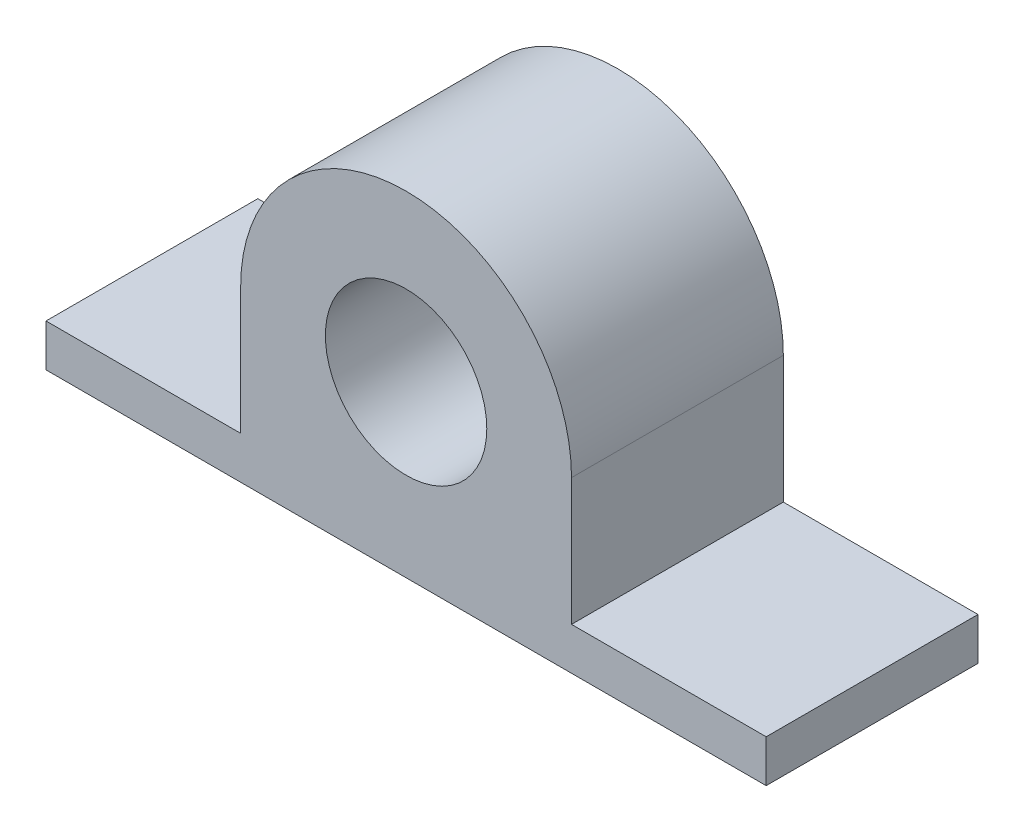
ISO-10303-21;
HEADER;
FILE_DESCRIPTION(('STEP AP214'),'2;1');
FILE_NAME('part.step','',(''),(''),'','','');
FILE_SCHEMA(('AUTOMOTIVE_DESIGN { 1 0 10303 214 1 1 1 1 }'));
ENDSEC;
DATA;
#1=APPLICATION_CONTEXT('core data for automotive mechanical design processes');
#2=APPLICATION_PROTOCOL_DEFINITION('international standard','automotive_design',2000,#1);
#3=PRODUCT_CONTEXT('',#1,'mechanical');
#4=PRODUCT('Part','Part','',(#3));
#5=PRODUCT_RELATED_PRODUCT_CATEGORY('part','',(#4));
#6=PRODUCT_DEFINITION_FORMATION('','',#4);
#7=PRODUCT_DEFINITION_CONTEXT('part definition',#1,'design');
#8=PRODUCT_DEFINITION('design','',#6,#7);
#9=PRODUCT_DEFINITION_SHAPE('','',#8);
#10=(LENGTH_UNIT() NAMED_UNIT(*) SI_UNIT(.MILLI.,.METRE.));
#11=(NAMED_UNIT(*) PLANE_ANGLE_UNIT() SI_UNIT($,.RADIAN.));
#12=(NAMED_UNIT(*) SI_UNIT($,.STERADIAN.) SOLID_ANGLE_UNIT());
#13=UNCERTAINTY_MEASURE_WITH_UNIT(LENGTH_MEASURE(1.E-05),#10,'distance_accuracy_value','');
#14=(GEOMETRIC_REPRESENTATION_CONTEXT(3) GLOBAL_UNCERTAINTY_ASSIGNED_CONTEXT((#13)) GLOBAL_UNIT_ASSIGNED_CONTEXT((#10,
#11,#12)) REPRESENTATION_CONTEXT('',''));
#15=CARTESIAN_POINT('',(0.,0.,0.));
#16=DIRECTION('',(0.,0.,1.));
#17=DIRECTION('',(1.,0.,0.));
#18=AXIS2_PLACEMENT_3D('',#15,#16,#17);
#19=CARTESIAN_POINT('',(0.,0.,12.5));
#20=DIRECTION('',(0.,0.,1.));
#21=DIRECTION('',(1.,0.,0.));
#22=AXIS2_PLACEMENT_3D('',#19,#20,#21);
#23=PLANE('',#22);
#24=DIRECTION('',(0.,-1.,0.));
#25=VECTOR('',#24,1.);
#26=CARTESIAN_POINT('',(-42.5,-15.,12.5));
#27=LINE('',#26,#25);
#28=CARTESIAN_POINT('',(-42.5,-15.,12.5));
#29=VERTEX_POINT('',#28);
#30=CARTESIAN_POINT('',(-42.5,-20.,12.5));
#31=VERTEX_POINT('',#30);
#32=EDGE_CURVE('E170',#29,#31,#27,.T.);
#33=ORIENTED_EDGE('',*,*,#32,.T.);
#34=DIRECTION('',(1.,0.,0.));
#35=VECTOR('',#34,1.);
#36=CARTESIAN_POINT('',(-42.5,-20.,12.5));
#37=LINE('',#36,#35);
#38=CARTESIAN_POINT('',(42.5,-20.,12.5));
#39=VERTEX_POINT('',#38);
#40=EDGE_CURVE('E106',#31,#39,#37,.T.);
#41=ORIENTED_EDGE('',*,*,#40,.T.);
#42=DIRECTION('',(0.,1.,0.));
#43=VECTOR('',#42,1.);
#44=CARTESIAN_POINT('',(42.5,-15.,12.5));
#45=LINE('',#44,#43);
#46=CARTESIAN_POINT('',(42.5,-15.,12.5));
#47=VERTEX_POINT('',#46);
#48=EDGE_CURVE('E191',#39,#47,#45,.T.);
#49=ORIENTED_EDGE('',*,*,#48,.T.);
#50=DIRECTION('',(-1.,0.,0.));
#51=VECTOR('',#50,1.);
#52=CARTESIAN_POINT('',(19.525,-15.,12.5));
#53=LINE('',#52,#51);
#54=CARTESIAN_POINT('',(19.525,-15.,12.5));
#55=VERTEX_POINT('',#54);
#56=EDGE_CURVE('E205',#47,#55,#53,.T.);
#57=ORIENTED_EDGE('',*,*,#56,.T.);
#58=DIRECTION('',(0.,1.,0.));
#59=VECTOR('',#58,1.);
#60=CARTESIAN_POINT('',(19.525,0.,12.5));
#61=LINE('',#60,#59);
#62=CARTESIAN_POINT('',(19.525,0.,12.5));
#63=VERTEX_POINT('',#62);
#64=EDGE_CURVE('E125',#55,#63,#61,.T.);
#65=ORIENTED_EDGE('',*,*,#64,.T.);
#66=CARTESIAN_POINT('',(0.,0.,12.5));
#67=DIRECTION('',(0.,0.,1.));
#68=DIRECTION('',(1.,0.,0.));
#69=AXIS2_PLACEMENT_3D('',#66,#67,#68);
#70=CIRCLE('',#69,19.525);
#71=CARTESIAN_POINT('',(-19.525,0.,12.5));
#72=VERTEX_POINT('',#71);
#73=EDGE_CURVE('E119',#63,#72,#70,.T.);
#74=ORIENTED_EDGE('',*,*,#73,.T.);
#75=DIRECTION('',(0.,-1.,0.));
#76=VECTOR('',#75,1.);
#77=CARTESIAN_POINT('',(-19.525,0.,12.5));
#78=LINE('',#77,#76);
#79=CARTESIAN_POINT('',(-19.525,-15.,12.5));
#80=VERTEX_POINT('',#79);
#81=EDGE_CURVE('E123',#72,#80,#78,.T.);
#82=ORIENTED_EDGE('',*,*,#81,.T.);
#83=DIRECTION('',(-1.,0.,0.));
#84=VECTOR('',#83,1.);
#85=CARTESIAN_POINT('',(-42.5,-15.,12.5));
#86=LINE('',#85,#84);
#87=EDGE_CURVE('E63',#80,#29,#86,.T.);
#88=ORIENTED_EDGE('',*,*,#87,.T.);
#89=EDGE_LOOP('',(#33,#41,#49,#57,#65,#74,#82,#88));
#90=FACE_BOUND('',#89,.T.);
#91=CARTESIAN_POINT('',(0.,0.,12.5));
#92=DIRECTION('',(0.,0.,1.));
#93=DIRECTION('',(1.,0.,0.));
#94=AXIS2_PLACEMENT_3D('',#91,#92,#93);
#95=CIRCLE('',#94,9.525);
#96=CARTESIAN_POINT('',(9.525,0.,12.5));
#97=VERTEX_POINT('',#96);
#98=EDGE_CURVE('E152',#97,#97,#95,.T.);
#99=ORIENTED_EDGE('',*,*,#98,.F.);
#100=EDGE_LOOP('',(#99));
#101=FACE_BOUND('',#100,.T.);
#102=ADVANCED_FACE('F45',(#90,#101),#23,.T.);
#103=CARTESIAN_POINT('',(0.,0.,-12.5));
#104=DIRECTION('',(0.,0.,1.));
#105=DIRECTION('',(1.,0.,0.));
#106=AXIS2_PLACEMENT_3D('',#103,#104,#105);
#107=PLANE('',#106);
#108=DIRECTION('',(0.,-1.,0.));
#109=VECTOR('',#108,1.);
#110=CARTESIAN_POINT('',(-42.5,-15.,-12.5));
#111=LINE('',#110,#109);
#112=CARTESIAN_POINT('',(-42.5,-15.,-12.5));
#113=VERTEX_POINT('',#112);
#114=CARTESIAN_POINT('',(-42.5,-20.,-12.5));
#115=VERTEX_POINT('',#114);
#116=EDGE_CURVE('E147',#113,#115,#111,.T.);
#117=ORIENTED_EDGE('',*,*,#116,.F.);
#118=DIRECTION('',(-1.,0.,0.));
#119=VECTOR('',#118,1.);
#120=CARTESIAN_POINT('',(-42.5,-15.,-12.5));
#121=LINE('',#120,#119);
#122=CARTESIAN_POINT('',(-19.525,-15.,-12.5));
#123=VERTEX_POINT('',#122);
#124=EDGE_CURVE('E98',#123,#113,#121,.T.);
#125=ORIENTED_EDGE('',*,*,#124,.F.);
#126=DIRECTION('',(0.,-1.,0.));
#127=VECTOR('',#126,1.);
#128=CARTESIAN_POINT('',(-19.525,0.,-12.5));
#129=LINE('',#128,#127);
#130=CARTESIAN_POINT('',(-19.525,0.,-12.5));
#131=VERTEX_POINT('',#130);
#132=EDGE_CURVE('E92',#131,#123,#129,.T.);
#133=ORIENTED_EDGE('',*,*,#132,.F.);
#134=CARTESIAN_POINT('',(0.,0.,-12.5));
#135=DIRECTION('',(0.,0.,1.));
#136=DIRECTION('',(1.,0.,0.));
#137=AXIS2_PLACEMENT_3D('',#134,#135,#136);
#138=CIRCLE('',#137,19.525);
#139=CARTESIAN_POINT('',(19.525,0.,-12.5));
#140=VERTEX_POINT('',#139);
#141=EDGE_CURVE('E134',#140,#131,#138,.T.);
#142=ORIENTED_EDGE('',*,*,#141,.F.);
#143=DIRECTION('',(0.,1.,0.));
#144=VECTOR('',#143,1.);
#145=CARTESIAN_POINT('',(19.525,0.,-12.5));
#146=LINE('',#145,#144);
#147=CARTESIAN_POINT('',(19.525,-15.,-12.5));
#148=VERTEX_POINT('',#147);
#149=EDGE_CURVE('E161',#148,#140,#146,.T.);
#150=ORIENTED_EDGE('',*,*,#149,.F.);
#151=DIRECTION('',(-1.,0.,0.));
#152=VECTOR('',#151,1.);
#153=CARTESIAN_POINT('',(19.525,-15.,-12.5));
#154=LINE('',#153,#152);
#155=CARTESIAN_POINT('',(42.5,-15.,-12.5));
#156=VERTEX_POINT('',#155);
#157=EDGE_CURVE('E158',#156,#148,#154,.T.);
#158=ORIENTED_EDGE('',*,*,#157,.F.);
#159=DIRECTION('',(0.,1.,0.));
#160=VECTOR('',#159,1.);
#161=CARTESIAN_POINT('',(42.5,-15.,-12.5));
#162=LINE('',#161,#160);
#163=CARTESIAN_POINT('',(42.5,-20.,-12.5));
#164=VERTEX_POINT('',#163);
#165=EDGE_CURVE('E155',#164,#156,#162,.T.);
#166=ORIENTED_EDGE('',*,*,#165,.F.);
#167=DIRECTION('',(1.,0.,0.));
#168=VECTOR('',#167,1.);
#169=CARTESIAN_POINT('',(-42.5,-20.,-12.5));
#170=LINE('',#169,#168);
#171=EDGE_CURVE('E151',#115,#164,#170,.T.);
#172=ORIENTED_EDGE('',*,*,#171,.F.);
#173=EDGE_LOOP('',(#117,#125,#133,#142,#150,#158,#166,#172));
#174=FACE_BOUND('',#173,.T.);
#175=CARTESIAN_POINT('',(0.,0.,-12.5));
#176=DIRECTION('',(0.,0.,1.));
#177=DIRECTION('',(1.,0.,0.));
#178=AXIS2_PLACEMENT_3D('',#175,#176,#177);
#179=CIRCLE('',#178,9.525);
#180=CARTESIAN_POINT('',(9.525,0.,-12.5));
#181=VERTEX_POINT('',#180);
#182=EDGE_CURVE('E215',#181,#181,#179,.T.);
#183=ORIENTED_EDGE('',*,*,#182,.T.);
#184=EDGE_LOOP('',(#183));
#185=FACE_BOUND('',#184,.T.);
#186=ADVANCED_FACE('F195',(#174,#185),#107,.F.);
#187=CARTESIAN_POINT('',(-42.5,-15.,12.5));
#188=DIRECTION('',(1.,0.,0.));
#189=DIRECTION('',(0.,0.,-1.));
#190=AXIS2_PLACEMENT_3D('',#187,#188,#189);
#191=PLANE('',#190);
#192=ORIENTED_EDGE('',*,*,#116,.T.);
#193=DIRECTION('',(0.,0.,-1.));
#194=VECTOR('',#193,1.);
#195=CARTESIAN_POINT('',(-42.5,-20.,12.5));
#196=LINE('',#195,#194);
#197=EDGE_CURVE('E11',#31,#115,#196,.T.);
#198=ORIENTED_EDGE('',*,*,#197,.F.);
#199=ORIENTED_EDGE('',*,*,#32,.F.);
#200=DIRECTION('',(0.,0.,-1.));
#201=VECTOR('',#200,1.);
#202=CARTESIAN_POINT('',(-42.5,-15.,12.5));
#203=LINE('',#202,#201);
#204=EDGE_CURVE('E143',#29,#113,#203,.T.);
#205=ORIENTED_EDGE('',*,*,#204,.T.);
#206=EDGE_LOOP('',(#192,#198,#199,#205));
#207=FACE_BOUND('',#206,.T.);
#208=ADVANCED_FACE('F47',(#207),#191,.F.);
#209=CARTESIAN_POINT('',(-42.5,-20.,12.5));
#210=DIRECTION('',(0.,1.,0.));
#211=DIRECTION('',(0.,0.,1.));
#212=AXIS2_PLACEMENT_3D('',#209,#210,#211);
#213=PLANE('',#212);
#214=ORIENTED_EDGE('',*,*,#171,.T.);
#215=DIRECTION('',(0.,0.,-1.));
#216=VECTOR('',#215,1.);
#217=CARTESIAN_POINT('',(42.5,-20.,12.5));
#218=LINE('',#217,#216);
#219=EDGE_CURVE('E55',#39,#164,#218,.T.);
#220=ORIENTED_EDGE('',*,*,#219,.F.);
#221=ORIENTED_EDGE('',*,*,#40,.F.);
#222=ORIENTED_EDGE('',*,*,#197,.T.);
#223=EDGE_LOOP('',(#214,#220,#221,#222));
#224=FACE_BOUND('',#223,.T.);
#225=ADVANCED_FACE('F245',(#224),#213,.F.);
#226=CARTESIAN_POINT('',(42.5,-15.,12.5));
#227=DIRECTION('',(-1.,0.,0.));
#228=DIRECTION('',(0.,0.,1.));
#229=AXIS2_PLACEMENT_3D('',#226,#227,#228);
#230=PLANE('',#229);
#231=ORIENTED_EDGE('',*,*,#165,.T.);
#232=DIRECTION('',(0.,0.,-1.));
#233=VECTOR('',#232,1.);
#234=CARTESIAN_POINT('',(42.5,-15.,12.5));
#235=LINE('',#234,#233);
#236=EDGE_CURVE('E181',#47,#156,#235,.T.);
#237=ORIENTED_EDGE('',*,*,#236,.F.);
#238=ORIENTED_EDGE('',*,*,#48,.F.);
#239=ORIENTED_EDGE('',*,*,#219,.T.);
#240=EDGE_LOOP('',(#231,#237,#238,#239));
#241=FACE_BOUND('',#240,.T.);
#242=ADVANCED_FACE('F189',(#241),#230,.F.);
#243=CARTESIAN_POINT('',(19.525,-15.,12.5));
#244=DIRECTION('',(0.,-1.,0.));
#245=DIRECTION('',(1.,0.,0.));
#246=AXIS2_PLACEMENT_3D('',#243,#244,#245);
#247=PLANE('',#246);
#248=ORIENTED_EDGE('',*,*,#157,.T.);
#249=DIRECTION('',(0.,0.,-1.));
#250=VECTOR('',#249,1.);
#251=CARTESIAN_POINT('',(19.525,-15.,12.5));
#252=LINE('',#251,#250);
#253=EDGE_CURVE('E177',#55,#148,#252,.T.);
#254=ORIENTED_EDGE('',*,*,#253,.F.);
#255=ORIENTED_EDGE('',*,*,#56,.F.);
#256=ORIENTED_EDGE('',*,*,#236,.T.);
#257=EDGE_LOOP('',(#248,#254,#255,#256));
#258=FACE_BOUND('',#257,.T.);
#259=ADVANCED_FACE('F200',(#258),#247,.F.);
#260=CARTESIAN_POINT('',(19.525,0.,12.5));
#261=DIRECTION('',(-1.,0.,0.));
#262=DIRECTION('',(0.,-1.,0.));
#263=AXIS2_PLACEMENT_3D('',#260,#261,#262);
#264=PLANE('',#263);
#265=ORIENTED_EDGE('',*,*,#149,.T.);
#266=DIRECTION('',(0.,0.,-1.));
#267=VECTOR('',#266,1.);
#268=CARTESIAN_POINT('',(19.525,0.,12.5));
#269=LINE('',#268,#267);
#270=EDGE_CURVE('E136',#63,#140,#269,.T.);
#271=ORIENTED_EDGE('',*,*,#270,.F.);
#272=ORIENTED_EDGE('',*,*,#64,.F.);
#273=ORIENTED_EDGE('',*,*,#253,.T.);
#274=EDGE_LOOP('',(#265,#271,#272,#273));
#275=FACE_BOUND('',#274,.T.);
#276=ADVANCED_FACE('F203',(#275),#264,.F.);
#277=CARTESIAN_POINT('',(0.,0.,12.5));
#278=DIRECTION('',(0.,0.,-1.));
#279=DIRECTION('',(-1.,0.,0.));
#280=AXIS2_PLACEMENT_3D('',#277,#278,#279);
#281=CYLINDRICAL_SURFACE('',#280,19.525);
#282=ORIENTED_EDGE('',*,*,#141,.T.);
#283=DIRECTION('',(0.,0.,-1.));
#284=VECTOR('',#283,1.);
#285=CARTESIAN_POINT('',(-19.525,0.,12.5));
#286=LINE('',#285,#284);
#287=EDGE_CURVE('E131',#72,#131,#286,.T.);
#288=ORIENTED_EDGE('',*,*,#287,.F.);
#289=ORIENTED_EDGE('',*,*,#73,.F.);
#290=ORIENTED_EDGE('',*,*,#270,.T.);
#291=EDGE_LOOP('',(#282,#288,#289,#290));
#292=FACE_BOUND('',#291,.T.);
#293=ADVANCED_FACE('F132',(#292),#281,.T.);
#294=CARTESIAN_POINT('',(-19.525,0.,12.5));
#295=DIRECTION('',(1.,0.,0.));
#296=DIRECTION('',(0.,1.,0.));
#297=AXIS2_PLACEMENT_3D('',#294,#295,#296);
#298=PLANE('',#297);
#299=ORIENTED_EDGE('',*,*,#132,.T.);
#300=DIRECTION('',(0.,0.,-1.));
#301=VECTOR('',#300,1.);
#302=CARTESIAN_POINT('',(-19.525,-15.,12.5));
#303=LINE('',#302,#301);
#304=EDGE_CURVE('E137',#80,#123,#303,.T.);
#305=ORIENTED_EDGE('',*,*,#304,.F.);
#306=ORIENTED_EDGE('',*,*,#81,.F.);
#307=ORIENTED_EDGE('',*,*,#287,.T.);
#308=EDGE_LOOP('',(#299,#305,#306,#307));
#309=FACE_BOUND('',#308,.T.);
#310=ADVANCED_FACE('F139',(#309),#298,.F.);
#311=CARTESIAN_POINT('',(-42.5,-15.,12.5));
#312=DIRECTION('',(0.,-1.,0.));
#313=DIRECTION('',(1.,0.,0.));
#314=AXIS2_PLACEMENT_3D('',#311,#312,#313);
#315=PLANE('',#314);
#316=ORIENTED_EDGE('',*,*,#124,.T.);
#317=ORIENTED_EDGE('',*,*,#204,.F.);
#318=ORIENTED_EDGE('',*,*,#87,.F.);
#319=ORIENTED_EDGE('',*,*,#304,.T.);
#320=EDGE_LOOP('',(#316,#317,#318,#319));
#321=FACE_BOUND('',#320,.T.);
#322=ADVANCED_FACE('F233',(#321),#315,.F.);
#323=CARTESIAN_POINT('',(0.,0.,12.5));
#324=DIRECTION('',(0.,0.,-1.));
#325=DIRECTION('',(-1.,0.,0.));
#326=AXIS2_PLACEMENT_3D('',#323,#324,#325);
#327=CYLINDRICAL_SURFACE('',#326,9.525);
#328=ORIENTED_EDGE('',*,*,#98,.T.);
#329=EDGE_LOOP('',(#328));
#330=FACE_BOUND('',#329,.T.);
#331=ORIENTED_EDGE('',*,*,#182,.F.);
#332=EDGE_LOOP('',(#331));
#333=FACE_BOUND('',#332,.T.);
#334=ADVANCED_FACE('F223',(#330,#333),#327,.F.);
#335=CLOSED_SHELL('',(#102,#186,#208,#225,#242,#259,#276,#293,#310,#322,#334));
#336=MANIFOLD_SOLID_BREP('B2',#335);
#337=ADVANCED_BREP_SHAPE_REPRESENTATION('',(#18,#336),#14);
#338=SHAPE_DEFINITION_REPRESENTATION(#9,#337);
ENDSEC;
END-ISO-10303-21;
